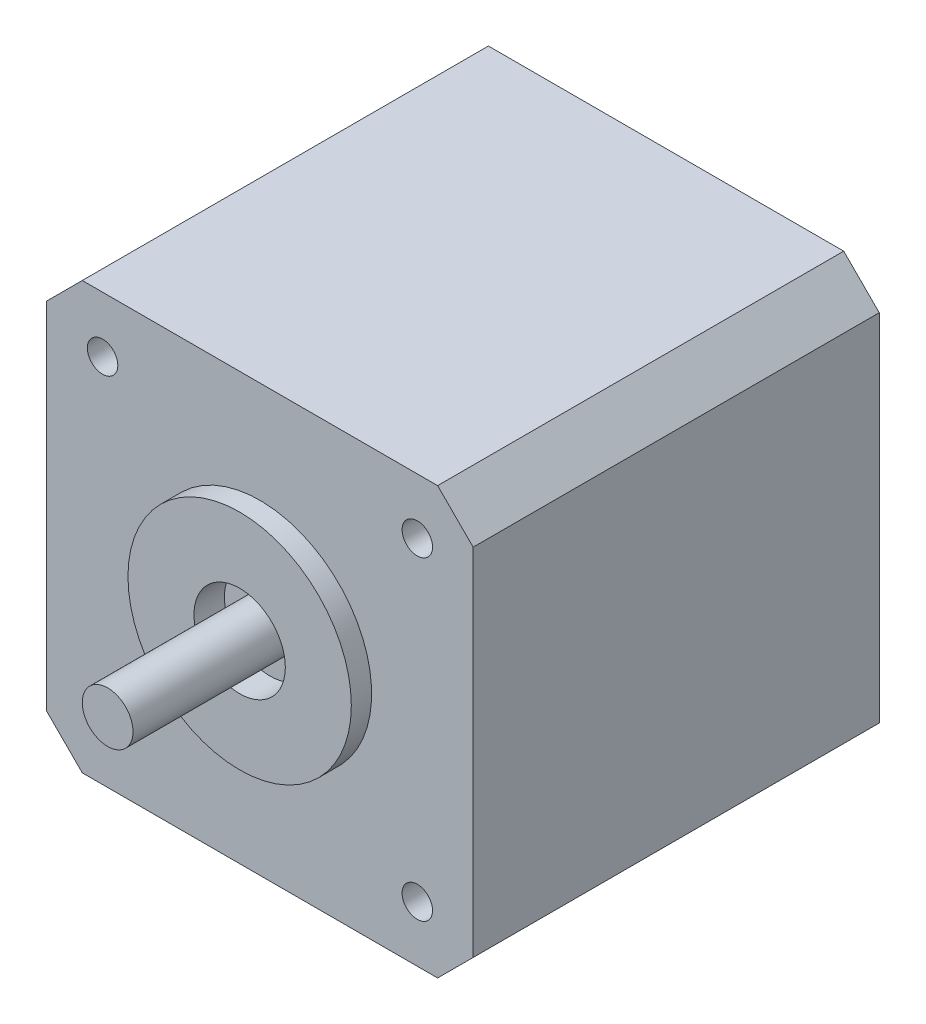
ISO-10303-21;
HEADER;
FILE_DESCRIPTION(('STEP AP214'),'2;1');
FILE_NAME('part.step','',(''),(''),'','','');
FILE_SCHEMA(('AUTOMOTIVE_DESIGN { 1 0 10303 214 1 1 1 1 }'));
ENDSEC;
DATA;
#1=APPLICATION_CONTEXT('core data for automotive mechanical design processes');
#2=APPLICATION_PROTOCOL_DEFINITION('international standard','automotive_design',2000,#1);
#3=PRODUCT_CONTEXT('',#1,'mechanical');
#4=PRODUCT('Part','Part','',(#3));
#5=PRODUCT_RELATED_PRODUCT_CATEGORY('part','',(#4));
#6=PRODUCT_DEFINITION_FORMATION('','',#4);
#7=PRODUCT_DEFINITION_CONTEXT('part definition',#1,'design');
#8=PRODUCT_DEFINITION('design','',#6,#7);
#9=PRODUCT_DEFINITION_SHAPE('','',#8);
#10=(LENGTH_UNIT() NAMED_UNIT(*) SI_UNIT(.MILLI.,.METRE.));
#11=(NAMED_UNIT(*) PLANE_ANGLE_UNIT() SI_UNIT($,.RADIAN.));
#12=(NAMED_UNIT(*) SI_UNIT($,.STERADIAN.) SOLID_ANGLE_UNIT());
#13=UNCERTAINTY_MEASURE_WITH_UNIT(LENGTH_MEASURE(1.E-05),#10,'distance_accuracy_value','');
#14=(GEOMETRIC_REPRESENTATION_CONTEXT(3) GLOBAL_UNCERTAINTY_ASSIGNED_CONTEXT((#13)) GLOBAL_UNIT_ASSIGNED_CONTEXT((#10,
#11,#12)) REPRESENTATION_CONTEXT('',''));
#15=CARTESIAN_POINT('',(0.,0.,0.));
#16=DIRECTION('',(0.,0.,1.));
#17=DIRECTION('',(1.,0.,0.));
#18=AXIS2_PLACEMENT_3D('',#15,#16,#17);
#19=CARTESIAN_POINT('',(21.,21.,-40.));
#20=DIRECTION('',(0.,0.,-1.));
#21=DIRECTION('',(-1.,0.,0.));
#22=AXIS2_PLACEMENT_3D('',#19,#20,#21);
#23=PLANE('',#22);
#24=DIRECTION('',(1.,0.,0.));
#25=VECTOR('',#24,1.);
#26=CARTESIAN_POINT('',(-21.,-21.,-40.));
#27=LINE('',#26,#25);
#28=CARTESIAN_POINT('',(-17.5,-21.,-40.));
#29=VERTEX_POINT('',#28);
#30=CARTESIAN_POINT('',(17.5,-21.,-40.));
#31=VERTEX_POINT('',#30);
#32=EDGE_CURVE('E124',#29,#31,#27,.T.);
#33=ORIENTED_EDGE('',*,*,#32,.F.);
#34=DIRECTION('',(0.707106781186549,-0.707106781186546,0.));
#35=VECTOR('',#34,1.);
#36=CARTESIAN_POINT('',(-19.2499999999999,-19.2500000000001,-40.));
#37=LINE('',#36,#35);
#38=CARTESIAN_POINT('',(-21.,-17.5,-40.));
#39=VERTEX_POINT('',#38);
#40=EDGE_CURVE('E146',#29,#39,#37,.F.);
#41=ORIENTED_EDGE('',*,*,#40,.T.);
#42=DIRECTION('',(0.,-1.,0.));
#43=VECTOR('',#42,1.);
#44=CARTESIAN_POINT('',(-21.,-21.,-40.));
#45=LINE('',#44,#43);
#46=CARTESIAN_POINT('',(-21.,17.5,-40.));
#47=VERTEX_POINT('',#46);
#48=EDGE_CURVE('E128',#47,#39,#45,.T.);
#49=ORIENTED_EDGE('',*,*,#48,.F.);
#50=DIRECTION('',(-0.707106781186546,-0.707106781186549,0.));
#51=VECTOR('',#50,1.);
#52=CARTESIAN_POINT('',(1.74999999999992,40.25,-40.));
#53=LINE('',#52,#51);
#54=CARTESIAN_POINT('',(-17.5,21.,-40.));
#55=VERTEX_POINT('',#54);
#56=EDGE_CURVE('E49',#47,#55,#53,.F.);
#57=ORIENTED_EDGE('',*,*,#56,.T.);
#58=DIRECTION('',(-1.,0.,0.));
#59=VECTOR('',#58,1.);
#60=CARTESIAN_POINT('',(-21.,21.,-40.));
#61=LINE('',#60,#59);
#62=CARTESIAN_POINT('',(17.5,21.,-40.));
#63=VERTEX_POINT('',#62);
#64=EDGE_CURVE('E154',#63,#55,#61,.T.);
#65=ORIENTED_EDGE('',*,*,#64,.F.);
#66=DIRECTION('',(-0.707106781186549,0.707106781186546,0.));
#67=VECTOR('',#66,1.);
#68=CARTESIAN_POINT('',(19.25,19.25,-40.));
#69=LINE('',#68,#67);
#70=CARTESIAN_POINT('',(21.,17.5,-40.));
#71=VERTEX_POINT('',#70);
#72=EDGE_CURVE('E141',#63,#71,#69,.F.);
#73=ORIENTED_EDGE('',*,*,#72,.T.);
#74=DIRECTION('',(0.,1.,0.));
#75=VECTOR('',#74,1.);
#76=CARTESIAN_POINT('',(21.,-21.,-40.));
#77=LINE('',#76,#75);
#78=CARTESIAN_POINT('',(21.,-17.5,-40.));
#79=VERTEX_POINT('',#78);
#80=EDGE_CURVE('E156',#79,#71,#77,.T.);
#81=ORIENTED_EDGE('',*,*,#80,.F.);
#82=DIRECTION('',(0.707106781186546,0.707106781186549,0.));
#83=VECTOR('',#82,1.);
#84=CARTESIAN_POINT('',(40.25,1.75000000000007,-40.));
#85=LINE('',#84,#83);
#86=EDGE_CURVE('E144',#79,#31,#85,.F.);
#87=ORIENTED_EDGE('',*,*,#86,.T.);
#88=EDGE_LOOP('',(#33,#41,#49,#57,#65,#73,#81,#87));
#89=FACE_BOUND('',#88,.T.);
#90=CARTESIAN_POINT('',(15.5,15.5,-40.));
#91=DIRECTION('',(0.,0.,1.));
#92=DIRECTION('',(1.,0.,0.));
#93=AXIS2_PLACEMENT_3D('',#90,#91,#92);
#94=CIRCLE('',#93,1.5);
#95=CARTESIAN_POINT('',(17.,15.5,-40.));
#96=VERTEX_POINT('',#95);
#97=EDGE_CURVE('E169',#96,#96,#94,.T.);
#98=ORIENTED_EDGE('',*,*,#97,.T.);
#99=EDGE_LOOP('',(#98));
#100=FACE_BOUND('',#99,.T.);
#101=CARTESIAN_POINT('',(-15.5,15.5,-40.));
#102=DIRECTION('',(0.,0.,1.));
#103=DIRECTION('',(1.,0.,0.));
#104=AXIS2_PLACEMENT_3D('',#101,#102,#103);
#105=CIRCLE('',#104,1.5);
#106=CARTESIAN_POINT('',(-14.,15.5,-40.));
#107=VERTEX_POINT('',#106);
#108=EDGE_CURVE('E177',#107,#107,#105,.T.);
#109=ORIENTED_EDGE('',*,*,#108,.T.);
#110=EDGE_LOOP('',(#109));
#111=FACE_BOUND('',#110,.T.);
#112=CARTESIAN_POINT('',(-15.5,-15.5,-40.));
#113=DIRECTION('',(0.,0.,1.));
#114=DIRECTION('',(1.,0.,0.));
#115=AXIS2_PLACEMENT_3D('',#112,#113,#114);
#116=CIRCLE('',#115,1.5);
#117=CARTESIAN_POINT('',(-14.,-15.5,-40.));
#118=VERTEX_POINT('',#117);
#119=EDGE_CURVE('E182',#118,#118,#116,.T.);
#120=ORIENTED_EDGE('',*,*,#119,.T.);
#121=EDGE_LOOP('',(#120));
#122=FACE_BOUND('',#121,.T.);
#123=CARTESIAN_POINT('',(15.5,-15.5,-40.));
#124=DIRECTION('',(0.,0.,1.));
#125=DIRECTION('',(1.,0.,0.));
#126=AXIS2_PLACEMENT_3D('',#123,#124,#125);
#127=CIRCLE('',#126,1.5);
#128=CARTESIAN_POINT('',(17.,-15.5,-40.));
#129=VERTEX_POINT('',#128);
#130=EDGE_CURVE('E188',#129,#129,#127,.T.);
#131=ORIENTED_EDGE('',*,*,#130,.T.);
#132=EDGE_LOOP('',(#131));
#133=FACE_BOUND('',#132,.T.);
#134=CARTESIAN_POINT('',(0.,0.,-40.));
#135=DIRECTION('',(0.,0.,-1.));
#136=DIRECTION('',(-1.,0.,0.));
#137=AXIS2_PLACEMENT_3D('',#134,#135,#136);
#138=CIRCLE('',#137,2.5);
#139=CARTESIAN_POINT('',(-2.5,0.,-40.));
#140=VERTEX_POINT('',#139);
#141=EDGE_CURVE('E200',#140,#140,#138,.T.);
#142=ORIENTED_EDGE('',*,*,#141,.F.);
#143=EDGE_LOOP('',(#142));
#144=FACE_BOUND('',#143,.T.);
#145=ADVANCED_FACE('F34',(#89,#100,#111,#122,#133,#144),#23,.T.);
#146=CARTESIAN_POINT('',(0.,0.,2.));
#147=DIRECTION('',(0.,0.,1.));
#148=DIRECTION('',(1.,0.,0.));
#149=AXIS2_PLACEMENT_3D('',#146,#147,#148);
#150=PLANE('',#149);
#151=CARTESIAN_POINT('',(0.,0.,2.));
#152=DIRECTION('',(0.,0.,1.));
#153=DIRECTION('',(1.,0.,0.));
#154=AXIS2_PLACEMENT_3D('',#151,#152,#153);
#155=CIRCLE('',#154,4.5);
#156=CARTESIAN_POINT('',(4.5,0.,2.));
#157=VERTEX_POINT('',#156);
#158=EDGE_CURVE('E206',#157,#157,#155,.T.);
#159=ORIENTED_EDGE('',*,*,#158,.F.);
#160=EDGE_LOOP('',(#159));
#161=FACE_BOUND('',#160,.T.);
#162=CARTESIAN_POINT('',(0.,0.,2.));
#163=DIRECTION('',(0.,0.,1.));
#164=DIRECTION('',(1.,0.,0.));
#165=AXIS2_PLACEMENT_3D('',#162,#163,#164);
#166=CIRCLE('',#165,11.);
#167=CARTESIAN_POINT('',(11.,0.,2.));
#168=VERTEX_POINT('',#167);
#169=EDGE_CURVE('E166',#168,#168,#166,.T.);
#170=ORIENTED_EDGE('',*,*,#169,.T.);
#171=EDGE_LOOP('',(#170));
#172=FACE_BOUND('',#171,.T.);
#173=ADVANCED_FACE('F231',(#161,#172),#150,.T.);
#174=CARTESIAN_POINT('',(21.,21.,0.));
#175=DIRECTION('',(0.,0.,-1.));
#176=DIRECTION('',(-1.,0.,0.));
#177=AXIS2_PLACEMENT_3D('',#174,#175,#176);
#178=PLANE('',#177);
#179=CARTESIAN_POINT('',(15.5,-15.5,0.));
#180=DIRECTION('',(0.,0.,1.));
#181=DIRECTION('',(1.,0.,0.));
#182=AXIS2_PLACEMENT_3D('',#179,#180,#181);
#183=CIRCLE('',#182,1.5);
#184=CARTESIAN_POINT('',(17.,-15.5,0.));
#185=VERTEX_POINT('',#184);
#186=EDGE_CURVE('E191',#185,#185,#183,.T.);
#187=ORIENTED_EDGE('',*,*,#186,.F.);
#188=EDGE_LOOP('',(#187));
#189=FACE_BOUND('',#188,.T.);
#190=CARTESIAN_POINT('',(-15.5,-15.5,0.));
#191=DIRECTION('',(0.,0.,1.));
#192=DIRECTION('',(1.,0.,0.));
#193=AXIS2_PLACEMENT_3D('',#190,#191,#192);
#194=CIRCLE('',#193,1.5);
#195=CARTESIAN_POINT('',(-14.,-15.5,0.));
#196=VERTEX_POINT('',#195);
#197=EDGE_CURVE('E185',#196,#196,#194,.T.);
#198=ORIENTED_EDGE('',*,*,#197,.F.);
#199=EDGE_LOOP('',(#198));
#200=FACE_BOUND('',#199,.T.);
#201=CARTESIAN_POINT('',(-15.5,15.5,0.));
#202=DIRECTION('',(0.,0.,1.));
#203=DIRECTION('',(1.,0.,0.));
#204=AXIS2_PLACEMENT_3D('',#201,#202,#203);
#205=CIRCLE('',#204,1.5);
#206=CARTESIAN_POINT('',(-14.,15.5,0.));
#207=VERTEX_POINT('',#206);
#208=EDGE_CURVE('E179',#207,#207,#205,.T.);
#209=ORIENTED_EDGE('',*,*,#208,.F.);
#210=EDGE_LOOP('',(#209));
#211=FACE_BOUND('',#210,.T.);
#212=CARTESIAN_POINT('',(15.5,15.5,0.));
#213=DIRECTION('',(0.,0.,1.));
#214=DIRECTION('',(1.,0.,0.));
#215=AXIS2_PLACEMENT_3D('',#212,#213,#214);
#216=CIRCLE('',#215,1.5);
#217=CARTESIAN_POINT('',(17.,15.5,0.));
#218=VERTEX_POINT('',#217);
#219=EDGE_CURVE('E173',#218,#218,#216,.T.);
#220=ORIENTED_EDGE('',*,*,#219,.F.);
#221=EDGE_LOOP('',(#220));
#222=FACE_BOUND('',#221,.T.);
#223=DIRECTION('',(0.,-1.,0.));
#224=VECTOR('',#223,1.);
#225=CARTESIAN_POINT('',(-21.,-21.,0.));
#226=LINE('',#225,#224);
#227=CARTESIAN_POINT('',(-21.,17.5,0.));
#228=VERTEX_POINT('',#227);
#229=CARTESIAN_POINT('',(-21.,-17.5,0.));
#230=VERTEX_POINT('',#229);
#231=EDGE_CURVE('E105',#228,#230,#226,.T.);
#232=ORIENTED_EDGE('',*,*,#231,.T.);
#233=DIRECTION('',(-0.707106781186549,0.707106781186546,0.));
#234=VECTOR('',#233,1.);
#235=CARTESIAN_POINT('',(-21.,-17.5,0.));
#236=LINE('',#235,#234);
#237=CARTESIAN_POINT('',(-17.5,-21.,0.));
#238=VERTEX_POINT('',#237);
#239=EDGE_CURVE('E134',#230,#238,#236,.F.);
#240=ORIENTED_EDGE('',*,*,#239,.T.);
#241=DIRECTION('',(1.,0.,0.));
#242=VECTOR('',#241,1.);
#243=CARTESIAN_POINT('',(-21.,-21.,0.));
#244=LINE('',#243,#242);
#245=CARTESIAN_POINT('',(17.5,-21.,0.));
#246=VERTEX_POINT('',#245);
#247=EDGE_CURVE('E121',#238,#246,#244,.T.);
#248=ORIENTED_EDGE('',*,*,#247,.T.);
#249=DIRECTION('',(-0.707106781186546,-0.707106781186549,0.));
#250=VECTOR('',#249,1.);
#251=CARTESIAN_POINT('',(17.5,-21.,0.));
#252=LINE('',#251,#250);
#253=CARTESIAN_POINT('',(21.,-17.5,0.));
#254=VERTEX_POINT('',#253);
#255=EDGE_CURVE('E111',#246,#254,#252,.F.);
#256=ORIENTED_EDGE('',*,*,#255,.T.);
#257=DIRECTION('',(0.,1.,0.));
#258=VECTOR('',#257,1.);
#259=CARTESIAN_POINT('',(21.,-21.,0.));
#260=LINE('',#259,#258);
#261=CARTESIAN_POINT('',(21.,17.5,0.));
#262=VERTEX_POINT('',#261);
#263=EDGE_CURVE('E163',#254,#262,#260,.T.);
#264=ORIENTED_EDGE('',*,*,#263,.T.);
#265=DIRECTION('',(0.707106781186549,-0.707106781186546,0.));
#266=VECTOR('',#265,1.);
#267=CARTESIAN_POINT('',(21.,17.5,0.));
#268=LINE('',#267,#266);
#269=CARTESIAN_POINT('',(17.5,21.,0.));
#270=VERTEX_POINT('',#269);
#271=EDGE_CURVE('E112',#262,#270,#268,.F.);
#272=ORIENTED_EDGE('',*,*,#271,.T.);
#273=DIRECTION('',(-1.,0.,0.));
#274=VECTOR('',#273,1.);
#275=CARTESIAN_POINT('',(-21.,21.,0.));
#276=LINE('',#275,#274);
#277=CARTESIAN_POINT('',(-17.5,21.,0.));
#278=VERTEX_POINT('',#277);
#279=EDGE_CURVE('E106',#270,#278,#276,.T.);
#280=ORIENTED_EDGE('',*,*,#279,.T.);
#281=DIRECTION('',(0.707106781186546,0.707106781186549,0.));
#282=VECTOR('',#281,1.);
#283=CARTESIAN_POINT('',(-17.5,21.,0.));
#284=LINE('',#283,#282);
#285=EDGE_CURVE('E101',#278,#228,#284,.F.);
#286=ORIENTED_EDGE('',*,*,#285,.T.);
#287=EDGE_LOOP('',(#232,#240,#248,#256,#264,#272,#280,#286));
#288=FACE_BOUND('',#287,.T.);
#289=CARTESIAN_POINT('',(0.,0.,0.));
#290=DIRECTION('',(0.,0.,-1.));
#291=DIRECTION('',(-1.,0.,0.));
#292=AXIS2_PLACEMENT_3D('',#289,#290,#291);
#293=CIRCLE('',#292,11.);
#294=CARTESIAN_POINT('',(-11.,0.,0.));
#295=VERTEX_POINT('',#294);
#296=EDGE_CURVE('E11',#295,#295,#293,.F.);
#297=ORIENTED_EDGE('',*,*,#296,.F.);
#298=EDGE_LOOP('',(#297));
#299=FACE_BOUND('',#298,.T.);
#300=ADVANCED_FACE('F103',(#189,#200,#211,#222,#288,#299),#178,.F.);
#301=CARTESIAN_POINT('',(21.,-21.,-40.));
#302=DIRECTION('',(1.,0.,0.));
#303=DIRECTION('',(0.,0.,-1.));
#304=AXIS2_PLACEMENT_3D('',#301,#302,#303);
#305=PLANE('',#304);
#306=ORIENTED_EDGE('',*,*,#263,.F.);
#307=DIRECTION('',(0.,0.,-1.));
#308=VECTOR('',#307,1.);
#309=CARTESIAN_POINT('',(21.,-17.5,-40.));
#310=LINE('',#309,#308);
#311=EDGE_CURVE('E151',#254,#79,#310,.T.);
#312=ORIENTED_EDGE('',*,*,#311,.T.);
#313=ORIENTED_EDGE('',*,*,#80,.T.);
#314=DIRECTION('',(0.,0.,1.));
#315=VECTOR('',#314,1.);
#316=CARTESIAN_POINT('',(21.,17.5,-40.));
#317=LINE('',#316,#315);
#318=EDGE_CURVE('E148',#71,#262,#317,.T.);
#319=ORIENTED_EDGE('',*,*,#318,.T.);
#320=EDGE_LOOP('',(#306,#312,#313,#319));
#321=FACE_BOUND('',#320,.T.);
#322=ADVANCED_FACE('F238',(#321),#305,.T.);
#323=CARTESIAN_POINT('',(-21.,-21.,-40.));
#324=DIRECTION('',(0.,-1.,0.));
#325=DIRECTION('',(0.,0.,-1.));
#326=AXIS2_PLACEMENT_3D('',#323,#324,#325);
#327=PLANE('',#326);
#328=ORIENTED_EDGE('',*,*,#247,.F.);
#329=DIRECTION('',(0.,0.,-1.));
#330=VECTOR('',#329,1.);
#331=CARTESIAN_POINT('',(-17.5,-21.,-40.));
#332=LINE('',#331,#330);
#333=EDGE_CURVE('E139',#238,#29,#332,.T.);
#334=ORIENTED_EDGE('',*,*,#333,.T.);
#335=ORIENTED_EDGE('',*,*,#32,.T.);
#336=DIRECTION('',(0.,0.,1.));
#337=VECTOR('',#336,1.);
#338=CARTESIAN_POINT('',(17.5,-21.,-40.));
#339=LINE('',#338,#337);
#340=EDGE_CURVE('E136',#31,#246,#339,.T.);
#341=ORIENTED_EDGE('',*,*,#340,.T.);
#342=EDGE_LOOP('',(#328,#334,#335,#341));
#343=FACE_BOUND('',#342,.T.);
#344=ADVANCED_FACE('F250',(#343),#327,.T.);
#345=CARTESIAN_POINT('',(-21.,-21.,-40.));
#346=DIRECTION('',(-1.,0.,0.));
#347=DIRECTION('',(0.,0.,1.));
#348=AXIS2_PLACEMENT_3D('',#345,#346,#347);
#349=PLANE('',#348);
#350=ORIENTED_EDGE('',*,*,#48,.T.);
#351=DIRECTION('',(0.,0.,1.));
#352=VECTOR('',#351,1.);
#353=CARTESIAN_POINT('',(-21.,-17.5,-40.));
#354=LINE('',#353,#352);
#355=EDGE_CURVE('E120',#39,#230,#354,.T.);
#356=ORIENTED_EDGE('',*,*,#355,.T.);
#357=ORIENTED_EDGE('',*,*,#231,.F.);
#358=DIRECTION('',(0.,0.,-1.));
#359=VECTOR('',#358,1.);
#360=CARTESIAN_POINT('',(-21.,17.5,-40.));
#361=LINE('',#360,#359);
#362=EDGE_CURVE('E118',#228,#47,#361,.T.);
#363=ORIENTED_EDGE('',*,*,#362,.T.);
#364=EDGE_LOOP('',(#350,#356,#357,#363));
#365=FACE_BOUND('',#364,.T.);
#366=ADVANCED_FACE('F117',(#365),#349,.T.);
#367=CARTESIAN_POINT('',(-21.,21.,-40.));
#368=DIRECTION('',(0.,1.,0.));
#369=DIRECTION('',(0.,0.,1.));
#370=AXIS2_PLACEMENT_3D('',#367,#368,#369);
#371=PLANE('',#370);
#372=ORIENTED_EDGE('',*,*,#64,.T.);
#373=DIRECTION('',(0.,0.,1.));
#374=VECTOR('',#373,1.);
#375=CARTESIAN_POINT('',(-17.5,21.,-40.));
#376=LINE('',#375,#374);
#377=EDGE_CURVE('E42',#55,#278,#376,.T.);
#378=ORIENTED_EDGE('',*,*,#377,.T.);
#379=ORIENTED_EDGE('',*,*,#279,.F.);
#380=DIRECTION('',(0.,0.,-1.));
#381=VECTOR('',#380,1.);
#382=CARTESIAN_POINT('',(17.5,21.,-40.));
#383=LINE('',#382,#381);
#384=EDGE_CURVE('E56',#270,#63,#383,.T.);
#385=ORIENTED_EDGE('',*,*,#384,.T.);
#386=EDGE_LOOP('',(#372,#378,#379,#385));
#387=FACE_BOUND('',#386,.T.);
#388=ADVANCED_FACE('F153',(#387),#371,.T.);
#389=CARTESIAN_POINT('',(-21.,-17.5,-40.));
#390=DIRECTION('',(0.707106781186546,0.707106781186549,0.));
#391=DIRECTION('',(-0.707106781186549,0.707106781186546,0.));
#392=AXIS2_PLACEMENT_3D('',#389,#390,#391);
#393=PLANE('',#392);
#394=ORIENTED_EDGE('',*,*,#40,.F.);
#395=ORIENTED_EDGE('',*,*,#333,.F.);
#396=ORIENTED_EDGE('',*,*,#239,.F.);
#397=ORIENTED_EDGE('',*,*,#355,.F.);
#398=EDGE_LOOP('',(#394,#395,#396,#397));
#399=FACE_BOUND('',#398,.T.);
#400=ADVANCED_FACE('F258',(#399),#393,.F.);
#401=CARTESIAN_POINT('',(17.5,-21.,-40.));
#402=DIRECTION('',(-0.707106781186549,0.707106781186546,0.));
#403=DIRECTION('',(-0.707106781186546,-0.707106781186549,0.));
#404=AXIS2_PLACEMENT_3D('',#401,#402,#403);
#405=PLANE('',#404);
#406=ORIENTED_EDGE('',*,*,#86,.F.);
#407=ORIENTED_EDGE('',*,*,#311,.F.);
#408=ORIENTED_EDGE('',*,*,#255,.F.);
#409=ORIENTED_EDGE('',*,*,#340,.F.);
#410=EDGE_LOOP('',(#406,#407,#408,#409));
#411=FACE_BOUND('',#410,.T.);
#412=ADVANCED_FACE('F264',(#411),#405,.F.);
#413=CARTESIAN_POINT('',(-17.5,21.,-40.));
#414=DIRECTION('',(0.707106781186549,-0.707106781186546,0.));
#415=DIRECTION('',(0.707106781186546,0.707106781186549,0.));
#416=AXIS2_PLACEMENT_3D('',#413,#414,#415);
#417=PLANE('',#416);
#418=ORIENTED_EDGE('',*,*,#56,.F.);
#419=ORIENTED_EDGE('',*,*,#362,.F.);
#420=ORIENTED_EDGE('',*,*,#285,.F.);
#421=ORIENTED_EDGE('',*,*,#377,.F.);
#422=EDGE_LOOP('',(#418,#419,#420,#421));
#423=FACE_BOUND('',#422,.T.);
#424=ADVANCED_FACE('F123',(#423),#417,.F.);
#425=CARTESIAN_POINT('',(21.,17.5,-40.));
#426=DIRECTION('',(-0.707106781186546,-0.707106781186549,0.));
#427=DIRECTION('',(0.707106781186549,-0.707106781186546,0.));
#428=AXIS2_PLACEMENT_3D('',#425,#426,#427);
#429=PLANE('',#428);
#430=ORIENTED_EDGE('',*,*,#72,.F.);
#431=ORIENTED_EDGE('',*,*,#384,.F.);
#432=ORIENTED_EDGE('',*,*,#271,.F.);
#433=ORIENTED_EDGE('',*,*,#318,.F.);
#434=EDGE_LOOP('',(#430,#431,#432,#433));
#435=FACE_BOUND('',#434,.T.);
#436=ADVANCED_FACE('F36',(#435),#429,.F.);
#437=CARTESIAN_POINT('',(0.,0.,2.));
#438=DIRECTION('',(0.,0.,-1.));
#439=DIRECTION('',(-1.,0.,0.));
#440=AXIS2_PLACEMENT_3D('',#437,#438,#439);
#441=CYLINDRICAL_SURFACE('',#440,11.);
#442=ORIENTED_EDGE('',*,*,#169,.F.);
#443=EDGE_LOOP('',(#442));
#444=FACE_BOUND('',#443,.T.);
#445=ORIENTED_EDGE('',*,*,#296,.T.);
#446=EDGE_LOOP('',(#445));
#447=FACE_BOUND('',#446,.T.);
#448=ADVANCED_FACE('F246',(#444,#447),#441,.T.);
#449=CARTESIAN_POINT('',(15.5,15.5,-40.));
#450=DIRECTION('',(0.,0.,1.));
#451=DIRECTION('',(1.,0.,0.));
#452=AXIS2_PLACEMENT_3D('',#449,#450,#451);
#453=CYLINDRICAL_SURFACE('',#452,1.5);
#454=ORIENTED_EDGE('',*,*,#97,.F.);
#455=EDGE_LOOP('',(#454));
#456=FACE_BOUND('',#455,.T.);
#457=ORIENTED_EDGE('',*,*,#219,.T.);
#458=EDGE_LOOP('',(#457));
#459=FACE_BOUND('',#458,.T.);
#460=ADVANCED_FACE('F244',(#456,#459),#453,.F.);
#461=CARTESIAN_POINT('',(-15.5,15.5,-40.));
#462=DIRECTION('',(0.,0.,1.));
#463=DIRECTION('',(1.,0.,0.));
#464=AXIS2_PLACEMENT_3D('',#461,#462,#463);
#465=CYLINDRICAL_SURFACE('',#464,1.5);
#466=ORIENTED_EDGE('',*,*,#108,.F.);
#467=EDGE_LOOP('',(#466));
#468=FACE_BOUND('',#467,.T.);
#469=ORIENTED_EDGE('',*,*,#208,.T.);
#470=EDGE_LOOP('',(#469));
#471=FACE_BOUND('',#470,.T.);
#472=ADVANCED_FACE('F319',(#468,#471),#465,.F.);
#473=CARTESIAN_POINT('',(-15.5,-15.5,-40.));
#474=DIRECTION('',(0.,0.,1.));
#475=DIRECTION('',(1.,0.,0.));
#476=AXIS2_PLACEMENT_3D('',#473,#474,#475);
#477=CYLINDRICAL_SURFACE('',#476,1.5);
#478=ORIENTED_EDGE('',*,*,#119,.F.);
#479=EDGE_LOOP('',(#478));
#480=FACE_BOUND('',#479,.T.);
#481=ORIENTED_EDGE('',*,*,#197,.T.);
#482=EDGE_LOOP('',(#481));
#483=FACE_BOUND('',#482,.T.);
#484=ADVANCED_FACE('F307',(#480,#483),#477,.F.);
#485=CARTESIAN_POINT('',(15.5,-15.5,-40.));
#486=DIRECTION('',(0.,0.,1.));
#487=DIRECTION('',(1.,0.,0.));
#488=AXIS2_PLACEMENT_3D('',#485,#486,#487);
#489=CYLINDRICAL_SURFACE('',#488,1.5);
#490=ORIENTED_EDGE('',*,*,#130,.F.);
#491=EDGE_LOOP('',(#490));
#492=FACE_BOUND('',#491,.T.);
#493=ORIENTED_EDGE('',*,*,#186,.T.);
#494=EDGE_LOOP('',(#493));
#495=FACE_BOUND('',#494,.T.);
#496=ADVANCED_FACE('F298',(#492,#495),#489,.F.);
#497=CARTESIAN_POINT('',(0.,0.,-55.));
#498=DIRECTION('',(0.,0.,1.));
#499=DIRECTION('',(1.,0.,0.));
#500=AXIS2_PLACEMENT_3D('',#497,#498,#499);
#501=CYLINDRICAL_SURFACE('',#500,2.5);
#502=CARTESIAN_POINT('',(0.,0.,-55.));
#503=DIRECTION('',(0.,0.,-1.));
#504=DIRECTION('',(-1.,0.,0.));
#505=AXIS2_PLACEMENT_3D('',#502,#503,#504);
#506=CIRCLE('',#505,2.5);
#507=CARTESIAN_POINT('',(-2.5,0.,-55.));
#508=VERTEX_POINT('',#507);
#509=EDGE_CURVE('E199',#508,#508,#506,.T.);
#510=ORIENTED_EDGE('',*,*,#509,.F.);
#511=EDGE_LOOP('',(#510));
#512=FACE_BOUND('',#511,.T.);
#513=ORIENTED_EDGE('',*,*,#141,.T.);
#514=EDGE_LOOP('',(#513));
#515=FACE_BOUND('',#514,.T.);
#516=ADVANCED_FACE('F296',(#512,#515),#501,.T.);
#517=CARTESIAN_POINT('',(0.,0.,-55.));
#518=DIRECTION('',(0.,0.,-1.));
#519=DIRECTION('',(-1.,0.,0.));
#520=AXIS2_PLACEMENT_3D('',#517,#518,#519);
#521=PLANE('',#520);
#522=ORIENTED_EDGE('',*,*,#509,.T.);
#523=EDGE_LOOP('',(#522));
#524=FACE_BOUND('',#523,.T.);
#525=ADVANCED_FACE('F227',(#524),#521,.T.);
#526=CARTESIAN_POINT('',(0.,0.,-1.));
#527=DIRECTION('',(0.,0.,1.));
#528=DIRECTION('',(1.,0.,0.));
#529=AXIS2_PLACEMENT_3D('',#526,#527,#528);
#530=CYLINDRICAL_SURFACE('',#529,4.5);
#531=CARTESIAN_POINT('',(0.,0.,-1.));
#532=DIRECTION('',(0.,0.,1.));
#533=DIRECTION('',(1.,0.,0.));
#534=AXIS2_PLACEMENT_3D('',#531,#532,#533);
#535=CIRCLE('',#534,4.5);
#536=CARTESIAN_POINT('',(4.5,0.,-1.));
#537=VERTEX_POINT('',#536);
#538=EDGE_CURVE('E203',#537,#537,#535,.T.);
#539=ORIENTED_EDGE('',*,*,#538,.F.);
#540=EDGE_LOOP('',(#539));
#541=FACE_BOUND('',#540,.T.);
#542=ORIENTED_EDGE('',*,*,#158,.T.);
#543=EDGE_LOOP('',(#542));
#544=FACE_BOUND('',#543,.T.);
#545=ADVANCED_FACE('F221',(#541,#544),#530,.F.);
#546=CARTESIAN_POINT('',(0.,0.,-1.));
#547=DIRECTION('',(0.,0.,1.));
#548=DIRECTION('',(1.,0.,0.));
#549=AXIS2_PLACEMENT_3D('',#546,#547,#548);
#550=PLANE('',#549);
#551=CARTESIAN_POINT('',(0.,0.,-1.));
#552=DIRECTION('',(0.,0.,1.));
#553=DIRECTION('',(1.,0.,0.));
#554=AXIS2_PLACEMENT_3D('',#551,#552,#553);
#555=CIRCLE('',#554,2.5);
#556=CARTESIAN_POINT('',(-2.5,0.,-0.999999999999997));
#557=VERTEX_POINT('',#556);
#558=EDGE_CURVE('E209',#557,#557,#555,.T.);
#559=ORIENTED_EDGE('',*,*,#558,.F.);
#560=EDGE_LOOP('',(#559));
#561=FACE_BOUND('',#560,.T.);
#562=ORIENTED_EDGE('',*,*,#538,.T.);
#563=EDGE_LOOP('',(#562));
#564=FACE_BOUND('',#563,.T.);
#565=ADVANCED_FACE('F217',(#561,#564),#550,.T.);
#566=CARTESIAN_POINT('',(0.,0.,15.));
#567=DIRECTION('',(0.,0.,1.));
#568=DIRECTION('',(1.,0.,0.));
#569=AXIS2_PLACEMENT_3D('',#566,#567,#568);
#570=PLANE('',#569);
#571=CARTESIAN_POINT('',(0.,0.,15.));
#572=DIRECTION('',(0.,0.,1.));
#573=DIRECTION('',(1.,0.,0.));
#574=AXIS2_PLACEMENT_3D('',#571,#572,#573);
#575=CIRCLE('',#574,2.5);
#576=CARTESIAN_POINT('',(-2.5,0.,15.));
#577=VERTEX_POINT('',#576);
#578=EDGE_CURVE('E194',#577,#577,#575,.T.);
#579=ORIENTED_EDGE('',*,*,#578,.T.);
#580=EDGE_LOOP('',(#579));
#581=FACE_BOUND('',#580,.T.);
#582=ADVANCED_FACE('F220',(#581),#570,.T.);
#583=CARTESIAN_POINT('',(0.,0.,15.));
#584=DIRECTION('',(0.,0.,-1.));
#585=DIRECTION('',(-1.,0.,0.));
#586=AXIS2_PLACEMENT_3D('',#583,#584,#585);
#587=CYLINDRICAL_SURFACE('',#586,2.5);
#588=CARTESIAN_POINT('',(-2.5,0.,15.));
#589=CARTESIAN_POINT('',(-2.5,0.,14.8333333333333));
#590=CARTESIAN_POINT('',(-2.5,0.,14.6666666666667));
#591=CARTESIAN_POINT('',(-2.5,0.,14.3333333333333));
#592=CARTESIAN_POINT('',(-2.5,0.,14.1666666666667));
#593=CARTESIAN_POINT('',(-2.5,0.,13.8333333333333));
#594=CARTESIAN_POINT('',(-2.5,0.,13.6666666666667));
#595=CARTESIAN_POINT('',(-2.5,0.,13.3333333333333));
#596=CARTESIAN_POINT('',(-2.5,0.,13.1666666666667));
#597=CARTESIAN_POINT('',(-2.5,0.,12.8333333333333));
#598=CARTESIAN_POINT('',(-2.5,0.,12.6666666666667));
#599=CARTESIAN_POINT('',(-2.5,0.,12.3333333333333));
#600=CARTESIAN_POINT('',(-2.5,0.,12.1666666666667));
#601=CARTESIAN_POINT('',(-2.5,0.,11.8333333333333));
#602=CARTESIAN_POINT('',(-2.5,0.,11.6666666666667));
#603=CARTESIAN_POINT('',(-2.5,0.,11.3333333333333));
#604=CARTESIAN_POINT('',(-2.5,0.,11.1666666666667));
#605=CARTESIAN_POINT('',(-2.5,0.,10.8333333333333));
#606=CARTESIAN_POINT('',(-2.5,0.,10.6666666666667));
#607=CARTESIAN_POINT('',(-2.5,0.,10.3333333333333));
#608=CARTESIAN_POINT('',(-2.5,0.,10.1666666666667));
#609=CARTESIAN_POINT('',(-2.5,0.,9.83333333333333));
#610=CARTESIAN_POINT('',(-2.5,0.,9.66666666666667));
#611=CARTESIAN_POINT('',(-2.5,0.,9.33333333333333));
#612=CARTESIAN_POINT('',(-2.5,0.,9.16666666666667));
#613=CARTESIAN_POINT('',(-2.5,0.,8.83333333333333));
#614=CARTESIAN_POINT('',(-2.5,0.,8.66666666666667));
#615=CARTESIAN_POINT('',(-2.5,0.,8.33333333333333));
#616=CARTESIAN_POINT('',(-2.5,0.,8.16666666666667));
#617=CARTESIAN_POINT('',(-2.5,0.,7.83333333333333));
#618=CARTESIAN_POINT('',(-2.5,0.,7.66666666666667));
#619=CARTESIAN_POINT('',(-2.5,0.,7.33333333333333));
#620=CARTESIAN_POINT('',(-2.5,0.,7.16666666666667));
#621=CARTESIAN_POINT('',(-2.5,0.,6.83333333333333));
#622=CARTESIAN_POINT('',(-2.5,0.,6.66666666666667));
#623=CARTESIAN_POINT('',(-2.5,0.,6.33333333333333));
#624=CARTESIAN_POINT('',(-2.5,0.,6.16666666666667));
#625=CARTESIAN_POINT('',(-2.5,0.,5.83333333333333));
#626=CARTESIAN_POINT('',(-2.5,0.,5.66666666666667));
#627=CARTESIAN_POINT('',(-2.5,0.,5.33333333333333));
#628=CARTESIAN_POINT('',(-2.5,0.,5.16666666666667));
#629=CARTESIAN_POINT('',(-2.5,0.,4.83333333333333));
#630=CARTESIAN_POINT('',(-2.5,0.,4.66666666666667));
#631=CARTESIAN_POINT('',(-2.5,0.,4.33333333333333));
#632=CARTESIAN_POINT('',(-2.5,0.,4.16666666666667));
#633=CARTESIAN_POINT('',(-2.5,0.,3.83333333333333));
#634=CARTESIAN_POINT('',(-2.5,0.,3.66666666666667));
#635=CARTESIAN_POINT('',(-2.5,0.,3.33333333333333));
#636=CARTESIAN_POINT('',(-2.5,0.,3.16666666666667));
#637=CARTESIAN_POINT('',(-2.5,0.,2.83333333333333));
#638=CARTESIAN_POINT('',(-2.5,0.,2.66666666666667));
#639=CARTESIAN_POINT('',(-2.5,0.,2.33333333333333));
#640=CARTESIAN_POINT('',(-2.5,0.,2.16666666666667));
#641=CARTESIAN_POINT('',(-2.5,0.,1.83333333333333));
#642=CARTESIAN_POINT('',(-2.5,0.,1.66666666666667));
#643=CARTESIAN_POINT('',(-2.5,0.,1.33333333333333));
#644=CARTESIAN_POINT('',(-2.5,0.,1.16666666666667));
#645=CARTESIAN_POINT('',(-2.5,0.,0.833333333333332));
#646=CARTESIAN_POINT('',(-2.5,0.,0.666666666666666));
#647=CARTESIAN_POINT('',(-2.5,0.,0.333333333333332));
#648=CARTESIAN_POINT('',(-2.5,0.,0.166666666666666));
#649=CARTESIAN_POINT('',(-2.5,0.,-0.166666666666667));
#650=CARTESIAN_POINT('',(-2.5,0.,-0.333333333333334));
#651=CARTESIAN_POINT('',(-2.5,0.,-0.666666666666666));
#652=CARTESIAN_POINT('',(-2.5,0.,-0.833333333333332));
#653=CARTESIAN_POINT('',(-2.5,0.,-0.999999999999997));
#654=B_SPLINE_CURVE_WITH_KNOTS('',3,(#588,#589,#590,#591,#592,#593,#594,#595,#596,#597,#598,
#599,#600,#601,#602,#603,#604,#605,#606,#607,#608,#609,#610,#611,#612,#613,#614,#615,#616,#617,
#618,#619,#620,#621,#622,#623,#624,#625,#626,#627,#628,#629,#630,#631,#632,#633,#634,#635,#636,
#637,#638,#639,#640,#641,#642,#643,#644,#645,#646,#647,#648,#649,#650,#651,#652,#653),
.UNSPECIFIED.,.F.,.F.,(4,2,2,2,2,2,2,2,2,2,2,2,2,2,2,2,2,2,2,2,2,2,2,2,2,2,2,2,2,2,2,2,4),(0.,
0.499999999999999,0.999999999999999,1.5,2.,2.5,3.,3.5,4.,4.5,5.,5.5,6.,6.5,7.,7.5,8.,8.5,9.,9.5,
10.,10.5,11.,11.5,12.,12.5,13.,13.5,14.,14.5,15.,15.5,16.),.UNSPECIFIED.);
#655=EDGE_CURVE('BSEAM215',#577,#557,#654,.T.);
#656=ORIENTED_EDGE('',*,*,#578,.F.);
#657=ORIENTED_EDGE('',*,*,#558,.T.);
#658=ORIENTED_EDGE('',*,*,#655,.T.);
#659=ORIENTED_EDGE('',*,*,#655,.F.);
#660=EDGE_LOOP('',(#656,#658,#657,#659));
#661=FACE_BOUND('',#660,.T.);
#662=ADVANCED_FACE('F215',(#661),#587,.T.);
#663=CLOSED_SHELL('',(#145,#173,#300,#322,#344,#366,#388,#400,#412,#424,#436,#448,#460,#472,
#484,#496,#516,#525,#545,#565,#582,#662));
#664=MANIFOLD_SOLID_BREP('B2',#663);
#665=ADVANCED_BREP_SHAPE_REPRESENTATION('',(#18,#664),#14);
#666=SHAPE_DEFINITION_REPRESENTATION(#9,#665);
ENDSEC;
END-ISO-10303-21;
